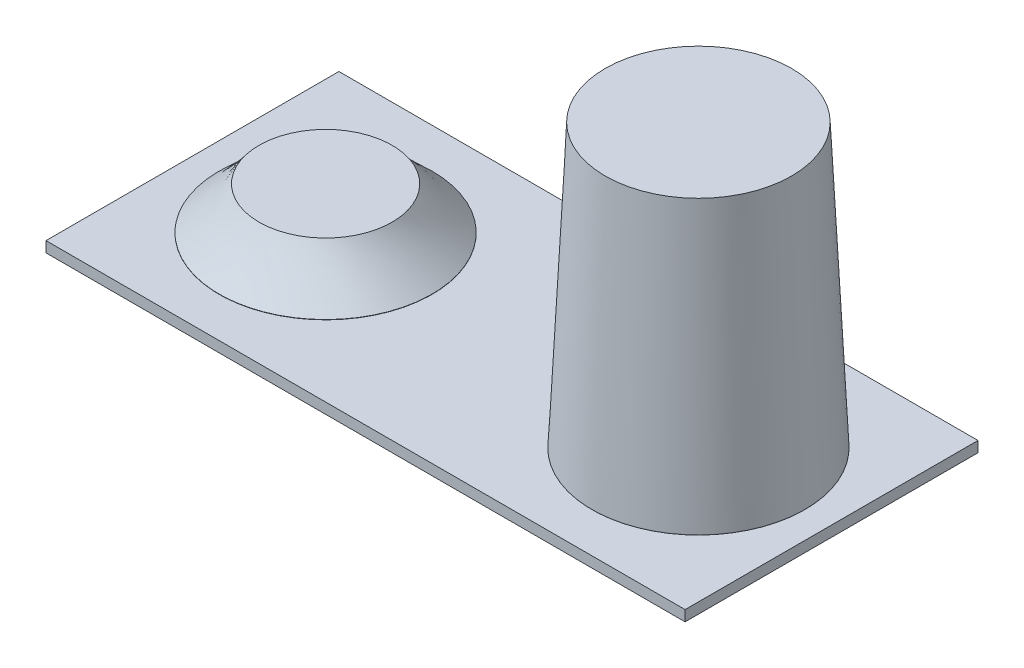
ISO-10303-21;
HEADER;
FILE_DESCRIPTION(('STEP AP214'),'2;1');
FILE_NAME('part.step','',(''),(''),'','','');
FILE_SCHEMA(('AUTOMOTIVE_DESIGN { 1 0 10303 214 1 1 1 1 }'));
ENDSEC;
DATA;
#1=APPLICATION_CONTEXT('core data for automotive mechanical design processes');
#2=APPLICATION_PROTOCOL_DEFINITION('international standard','automotive_design',2000,#1);
#3=PRODUCT_CONTEXT('',#1,'mechanical');
#4=PRODUCT('Part','Part','',(#3));
#5=PRODUCT_RELATED_PRODUCT_CATEGORY('part','',(#4));
#6=PRODUCT_DEFINITION_FORMATION('','',#4);
#7=PRODUCT_DEFINITION_CONTEXT('part definition',#1,'design');
#8=PRODUCT_DEFINITION('design','',#6,#7);
#9=PRODUCT_DEFINITION_SHAPE('','',#8);
#10=(LENGTH_UNIT() NAMED_UNIT(*) SI_UNIT(.MILLI.,.METRE.));
#11=(NAMED_UNIT(*) PLANE_ANGLE_UNIT() SI_UNIT($,.RADIAN.));
#12=(NAMED_UNIT(*) SI_UNIT($,.STERADIAN.) SOLID_ANGLE_UNIT());
#13=UNCERTAINTY_MEASURE_WITH_UNIT(LENGTH_MEASURE(1.E-05),#10,'distance_accuracy_value','');
#14=(GEOMETRIC_REPRESENTATION_CONTEXT(3) GLOBAL_UNCERTAINTY_ASSIGNED_CONTEXT((#13)) GLOBAL_UNIT_ASSIGNED_CONTEXT((#10,
#11,#12)) REPRESENTATION_CONTEXT('',''));
#15=CARTESIAN_POINT('',(0.,0.,0.));
#16=DIRECTION('',(0.,0.,1.));
#17=DIRECTION('',(1.,0.,0.));
#18=AXIS2_PLACEMENT_3D('',#15,#16,#17);
#19=CARTESIAN_POINT('',(-5.,0.4,-5.5));
#20=DIRECTION('',(1.,0.,0.));
#21=DIRECTION('',(0.,0.,-1.));
#22=AXIS2_PLACEMENT_3D('',#19,#20,#21);
#23=PLANE('',#22);
#24=DIRECTION('',(0.,0.,1.));
#25=VECTOR('',#24,1.);
#26=CARTESIAN_POINT('',(-5.,0.,-5.5));
#27=LINE('',#26,#25);
#28=CARTESIAN_POINT('',(-5.,0.,-5.5));
#29=VERTEX_POINT('',#28);
#30=CARTESIAN_POINT('',(-5.,0.,5.5));
#31=VERTEX_POINT('',#30);
#32=EDGE_CURVE('E104',#29,#31,#27,.T.);
#33=ORIENTED_EDGE('',*,*,#32,.T.);
#34=DIRECTION('',(0.,-1.,0.));
#35=VECTOR('',#34,1.);
#36=CARTESIAN_POINT('',(-5.,0.4,5.5));
#37=LINE('',#36,#35);
#38=CARTESIAN_POINT('',(-5.,0.4,5.5));
#39=VERTEX_POINT('',#38);
#40=EDGE_CURVE('E12',#39,#31,#37,.T.);
#41=ORIENTED_EDGE('',*,*,#40,.F.);
#42=DIRECTION('',(0.,0.,1.));
#43=VECTOR('',#42,1.);
#44=CARTESIAN_POINT('',(-5.,0.4,-5.5));
#45=LINE('',#44,#43);
#46=CARTESIAN_POINT('',(-5.,0.4,-5.5));
#47=VERTEX_POINT('',#46);
#48=EDGE_CURVE('E90',#47,#39,#45,.T.);
#49=ORIENTED_EDGE('',*,*,#48,.F.);
#50=DIRECTION('',(0.,-1.,0.));
#51=VECTOR('',#50,1.);
#52=CARTESIAN_POINT('',(-5.,0.4,-5.5));
#53=LINE('',#52,#51);
#54=EDGE_CURVE('E57',#47,#29,#53,.T.);
#55=ORIENTED_EDGE('',*,*,#54,.T.);
#56=EDGE_LOOP('',(#33,#41,#49,#55));
#57=FACE_BOUND('',#56,.T.);
#58=ADVANCED_FACE('F41',(#57),#23,.F.);
#59=CARTESIAN_POINT('',(-5.,0.4,5.5));
#60=DIRECTION('',(0.,0.,-1.));
#61=DIRECTION('',(-1.,0.,0.));
#62=AXIS2_PLACEMENT_3D('',#59,#60,#61);
#63=PLANE('',#62);
#64=DIRECTION('',(1.,0.,0.));
#65=VECTOR('',#64,1.);
#66=CARTESIAN_POINT('',(-5.,0.,5.5));
#67=LINE('',#66,#65);
#68=CARTESIAN_POINT('',(19.,0.,5.5));
#69=VERTEX_POINT('',#68);
#70=EDGE_CURVE('E95',#31,#69,#67,.T.);
#71=ORIENTED_EDGE('',*,*,#70,.T.);
#72=DIRECTION('',(0.,-1.,0.));
#73=VECTOR('',#72,1.);
#74=CARTESIAN_POINT('',(19.,0.4,5.5));
#75=LINE('',#74,#73);
#76=CARTESIAN_POINT('',(19.,0.4,5.5));
#77=VERTEX_POINT('',#76);
#78=EDGE_CURVE('E49',#77,#69,#75,.T.);
#79=ORIENTED_EDGE('',*,*,#78,.F.);
#80=DIRECTION('',(1.,0.,0.));
#81=VECTOR('',#80,1.);
#82=CARTESIAN_POINT('',(-5.,0.4,5.5));
#83=LINE('',#82,#81);
#84=EDGE_CURVE('E82',#39,#77,#83,.T.);
#85=ORIENTED_EDGE('',*,*,#84,.F.);
#86=ORIENTED_EDGE('',*,*,#40,.T.);
#87=EDGE_LOOP('',(#71,#79,#85,#86));
#88=FACE_BOUND('',#87,.T.);
#89=ADVANCED_FACE('F94',(#88),#63,.F.);
#90=CARTESIAN_POINT('',(19.,0.4,-5.5));
#91=DIRECTION('',(1.,0.,0.));
#92=DIRECTION('',(0.,0.,-1.));
#93=AXIS2_PLACEMENT_3D('',#90,#91,#92);
#94=PLANE('',#93);
#95=DIRECTION('',(0.,0.,1.));
#96=VECTOR('',#95,1.);
#97=CARTESIAN_POINT('',(19.,0.,-5.5));
#98=LINE('',#97,#96);
#99=CARTESIAN_POINT('',(19.,0.,-5.5));
#100=VERTEX_POINT('',#99);
#101=EDGE_CURVE('E108',#100,#69,#98,.T.);
#102=ORIENTED_EDGE('',*,*,#101,.F.);
#103=DIRECTION('',(0.,-1.,0.));
#104=VECTOR('',#103,1.);
#105=CARTESIAN_POINT('',(19.,0.4,-5.5));
#106=LINE('',#105,#104);
#107=CARTESIAN_POINT('',(19.,0.4,-5.5));
#108=VERTEX_POINT('',#107);
#109=EDGE_CURVE('E71',#108,#100,#106,.T.);
#110=ORIENTED_EDGE('',*,*,#109,.F.);
#111=DIRECTION('',(0.,0.,1.));
#112=VECTOR('',#111,1.);
#113=CARTESIAN_POINT('',(19.,0.4,-5.5));
#114=LINE('',#113,#112);
#115=EDGE_CURVE('E89',#108,#77,#114,.T.);
#116=ORIENTED_EDGE('',*,*,#115,.T.);
#117=ORIENTED_EDGE('',*,*,#78,.T.);
#118=EDGE_LOOP('',(#102,#110,#116,#117));
#119=FACE_BOUND('',#118,.T.);
#120=ADVANCED_FACE('F98',(#119),#94,.T.);
#121=CARTESIAN_POINT('',(-5.,0.4,-5.5));
#122=DIRECTION('',(0.,0.,-1.));
#123=DIRECTION('',(-1.,0.,0.));
#124=AXIS2_PLACEMENT_3D('',#121,#122,#123);
#125=PLANE('',#124);
#126=DIRECTION('',(1.,0.,0.));
#127=VECTOR('',#126,1.);
#128=CARTESIAN_POINT('',(-5.,0.,-5.5));
#129=LINE('',#128,#127);
#130=EDGE_CURVE('E110',#29,#100,#129,.T.);
#131=ORIENTED_EDGE('',*,*,#130,.F.);
#132=ORIENTED_EDGE('',*,*,#54,.F.);
#133=DIRECTION('',(1.,0.,0.));
#134=VECTOR('',#133,1.);
#135=CARTESIAN_POINT('',(-5.,0.4,-5.5));
#136=LINE('',#135,#134);
#137=EDGE_CURVE('E99',#47,#108,#136,.T.);
#138=ORIENTED_EDGE('',*,*,#137,.T.);
#139=ORIENTED_EDGE('',*,*,#109,.T.);
#140=EDGE_LOOP('',(#131,#132,#138,#139));
#141=FACE_BOUND('',#140,.T.);
#142=ADVANCED_FACE('F154',(#141),#125,.T.);
#143=CARTESIAN_POINT('',(0.,0.4,0.));
#144=DIRECTION('',(0.,1.,0.));
#145=DIRECTION('',(0.,0.,1.));
#146=AXIS2_PLACEMENT_3D('',#143,#144,#145);
#147=PLANE('',#146);
#148=CARTESIAN_POINT('',(14.,0.4,0.));
#149=DIRECTION('',(0.,1.,0.));
#150=DIRECTION('',(0.,0.,1.));
#151=AXIS2_PLACEMENT_3D('',#148,#149,#150);
#152=CIRCLE('',#151,4.);
#153=CARTESIAN_POINT('',(14.,0.4,-4.));
#154=VERTEX_POINT('',#153);
#155=EDGE_CURVE('E119',#154,#154,#152,.T.);
#156=ORIENTED_EDGE('',*,*,#155,.F.);
#157=EDGE_LOOP('',(#156));
#158=FACE_BOUND('',#157,.T.);
#159=CARTESIAN_POINT('',(0.,0.4,0.));
#160=DIRECTION('',(0.,1.,0.));
#161=DIRECTION('',(0.,0.,1.));
#162=AXIS2_PLACEMENT_3D('',#159,#160,#161);
#163=CIRCLE('',#162,4.);
#164=CARTESIAN_POINT('',(0.,0.4,-4.));
#165=VERTEX_POINT('',#164);
#166=EDGE_CURVE('E116',#165,#165,#163,.T.);
#167=ORIENTED_EDGE('',*,*,#166,.F.);
#168=EDGE_LOOP('',(#167));
#169=FACE_BOUND('',#168,.T.);
#170=ORIENTED_EDGE('',*,*,#48,.T.);
#171=ORIENTED_EDGE('',*,*,#84,.T.);
#172=ORIENTED_EDGE('',*,*,#115,.F.);
#173=ORIENTED_EDGE('',*,*,#137,.F.);
#174=EDGE_LOOP('',(#170,#171,#172,#173));
#175=FACE_BOUND('',#174,.T.);
#176=ADVANCED_FACE('F86',(#158,#169,#175),#147,.T.);
#177=CARTESIAN_POINT('',(0.,0.,0.));
#178=DIRECTION('',(0.,1.,0.));
#179=DIRECTION('',(0.,0.,1.));
#180=AXIS2_PLACEMENT_3D('',#177,#178,#179);
#181=PLANE('',#180);
#182=ORIENTED_EDGE('',*,*,#32,.F.);
#183=ORIENTED_EDGE('',*,*,#130,.T.);
#184=ORIENTED_EDGE('',*,*,#101,.T.);
#185=ORIENTED_EDGE('',*,*,#70,.F.);
#186=EDGE_LOOP('',(#182,#183,#184,#185));
#187=FACE_BOUND('',#186,.T.);
#188=ADVANCED_FACE('F153',(#187),#181,.F.);
#189=CARTESIAN_POINT('',(0.,0.41,0.));
#190=DIRECTION('',(0.,-1.,0.));
#191=DIRECTION('',(0.,0.,-1.));
#192=AXIS2_PLACEMENT_3D('',#189,#190,#191);
#193=CYLINDRICAL_SURFACE('',#192,4.);
#194=CARTESIAN_POINT('',(0.,0.41,0.));
#195=DIRECTION('',(0.,1.,0.));
#196=DIRECTION('',(0.,0.,1.));
#197=AXIS2_PLACEMENT_3D('',#194,#195,#196);
#198=CIRCLE('',#197,4.);
#199=CARTESIAN_POINT('',(0.,0.41,-4.));
#200=VERTEX_POINT('',#199);
#201=EDGE_CURVE('E106',#200,#200,#198,.T.);
#202=CARTESIAN_POINT('',(0.,0.41,-4.));
#203=CARTESIAN_POINT('',(0.,0.409895833333333,-4.));
#204=CARTESIAN_POINT('',(0.,0.409791666666667,-4.));
#205=CARTESIAN_POINT('',(0.,0.409583333333333,-4.));
#206=CARTESIAN_POINT('',(0.,0.409479166666667,-4.));
#207=CARTESIAN_POINT('',(0.,0.409270833333333,-4.));
#208=CARTESIAN_POINT('',(0.,0.409166666666667,-4.));
#209=CARTESIAN_POINT('',(0.,0.408958333333333,-4.));
#210=CARTESIAN_POINT('',(0.,0.408854166666667,-4.));
#211=CARTESIAN_POINT('',(0.,0.408645833333333,-4.));
#212=CARTESIAN_POINT('',(0.,0.408541666666667,-4.));
#213=CARTESIAN_POINT('',(0.,0.408333333333333,-4.));
#214=CARTESIAN_POINT('',(0.,0.408229166666667,-4.));
#215=CARTESIAN_POINT('',(0.,0.408020833333333,-4.));
#216=CARTESIAN_POINT('',(0.,0.407916666666667,-4.));
#217=CARTESIAN_POINT('',(0.,0.407708333333333,-4.));
#218=CARTESIAN_POINT('',(0.,0.407604166666667,-4.));
#219=CARTESIAN_POINT('',(0.,0.407395833333333,-4.));
#220=CARTESIAN_POINT('',(0.,0.407291666666667,-4.));
#221=CARTESIAN_POINT('',(0.,0.407083333333333,-4.));
#222=CARTESIAN_POINT('',(0.,0.406979166666667,-4.));
#223=CARTESIAN_POINT('',(0.,0.406770833333333,-4.));
#224=CARTESIAN_POINT('',(0.,0.406666666666667,-4.));
#225=CARTESIAN_POINT('',(0.,0.406458333333333,-4.));
#226=CARTESIAN_POINT('',(0.,0.406354166666667,-4.));
#227=CARTESIAN_POINT('',(0.,0.406145833333333,-4.));
#228=CARTESIAN_POINT('',(0.,0.406041666666667,-4.));
#229=CARTESIAN_POINT('',(0.,0.405833333333333,-4.));
#230=CARTESIAN_POINT('',(0.,0.405729166666667,-4.));
#231=CARTESIAN_POINT('',(0.,0.405520833333333,-4.));
#232=CARTESIAN_POINT('',(0.,0.405416666666667,-4.));
#233=CARTESIAN_POINT('',(0.,0.405208333333333,-4.));
#234=CARTESIAN_POINT('',(0.,0.405104166666667,-4.));
#235=CARTESIAN_POINT('',(0.,0.404895833333333,-4.));
#236=CARTESIAN_POINT('',(0.,0.404791666666667,-4.));
#237=CARTESIAN_POINT('',(0.,0.404583333333333,-4.));
#238=CARTESIAN_POINT('',(0.,0.404479166666667,-4.));
#239=CARTESIAN_POINT('',(0.,0.404270833333333,-4.));
#240=CARTESIAN_POINT('',(0.,0.404166666666667,-4.));
#241=CARTESIAN_POINT('',(0.,0.403958333333333,-4.));
#242=CARTESIAN_POINT('',(0.,0.403854166666667,-4.));
#243=CARTESIAN_POINT('',(0.,0.403645833333333,-4.));
#244=CARTESIAN_POINT('',(0.,0.403541666666667,-4.));
#245=CARTESIAN_POINT('',(0.,0.403333333333333,-4.));
#246=CARTESIAN_POINT('',(0.,0.403229166666667,-4.));
#247=CARTESIAN_POINT('',(0.,0.403020833333333,-4.));
#248=CARTESIAN_POINT('',(0.,0.402916666666667,-4.));
#249=CARTESIAN_POINT('',(0.,0.402708333333333,-4.));
#250=CARTESIAN_POINT('',(0.,0.402604166666667,-4.));
#251=CARTESIAN_POINT('',(0.,0.402395833333333,-4.));
#252=CARTESIAN_POINT('',(0.,0.402291666666667,-4.));
#253=CARTESIAN_POINT('',(0.,0.402083333333333,-4.));
#254=CARTESIAN_POINT('',(0.,0.401979166666667,-4.));
#255=CARTESIAN_POINT('',(0.,0.401770833333333,-4.));
#256=CARTESIAN_POINT('',(0.,0.401666666666667,-4.));
#257=CARTESIAN_POINT('',(0.,0.401458333333333,-4.));
#258=CARTESIAN_POINT('',(0.,0.401354166666667,-4.));
#259=CARTESIAN_POINT('',(0.,0.401145833333333,-4.));
#260=CARTESIAN_POINT('',(0.,0.401041666666667,-4.));
#261=CARTESIAN_POINT('',(0.,0.400833333333333,-4.));
#262=CARTESIAN_POINT('',(0.,0.400729166666667,-4.));
#263=CARTESIAN_POINT('',(0.,0.400520833333333,-4.));
#264=CARTESIAN_POINT('',(0.,0.400416666666667,-4.));
#265=CARTESIAN_POINT('',(0.,0.400208333333333,-4.));
#266=CARTESIAN_POINT('',(0.,0.400104166666667,-4.));
#267=CARTESIAN_POINT('',(0.,0.4,-4.));
#268=B_SPLINE_CURVE_WITH_KNOTS('',3,(#202,#203,#204,#205,#206,#207,#208,#209,#210,#211,#212,
#213,#214,#215,#216,#217,#218,#219,#220,#221,#222,#223,#224,#225,#226,#227,#228,#229,#230,#231,
#232,#233,#234,#235,#236,#237,#238,#239,#240,#241,#242,#243,#244,#245,#246,#247,#248,#249,#250,
#251,#252,#253,#254,#255,#256,#257,#258,#259,#260,#261,#262,#263,#264,#265,#266,#267),
.UNSPECIFIED.,.F.,.F.,(4,2,2,2,2,2,2,2,2,2,2,2,2,2,2,2,2,2,2,2,2,2,2,2,2,2,2,2,2,2,2,2,4),(0.,
0.000312499999999987,0.000624999999999975,0.000937499999999962,0.00124999999999995,
0.00156249999999999,0.00187499999999998,0.00218749999999997,0.00249999999999995,
0.00281249999999999,0.00312499999999998,0.00343749999999997,0.00374999999999996,0.0040625,
0.00437499999999998,0.00468749999999997,0.00499999999999996,0.0053125,0.00562499999999999,
0.00593749999999997,0.00624999999999996,0.0065625,0.00687499999999999,0.00718749999999998,
0.00749999999999997,0.00781250000000001,0.00812499999999999,0.00843749999999998,
0.00874999999999997,0.00906250000000001,0.009375,0.00968749999999998,0.00999999999999997),.UNSPECIFIED.);
#269=EDGE_CURVE('BSEAM147',#200,#165,#268,.T.);
#270=ORIENTED_EDGE('',*,*,#201,.F.);
#271=ORIENTED_EDGE('',*,*,#166,.T.);
#272=ORIENTED_EDGE('',*,*,#269,.T.);
#273=ORIENTED_EDGE('',*,*,#269,.F.);
#274=EDGE_LOOP('',(#270,#272,#271,#273));
#275=FACE_BOUND('',#274,.T.);
#276=ADVANCED_FACE('F147',(#275),#193,.T.);
#277=CARTESIAN_POINT('',(14.,0.41,0.));
#278=DIRECTION('',(0.,-1.,0.));
#279=DIRECTION('',(0.,0.,-1.));
#280=AXIS2_PLACEMENT_3D('',#277,#278,#279);
#281=CYLINDRICAL_SURFACE('',#280,4.);
#282=CARTESIAN_POINT('',(14.,0.41,0.));
#283=DIRECTION('',(0.,1.,0.));
#284=DIRECTION('',(0.,0.,1.));
#285=AXIS2_PLACEMENT_3D('',#282,#283,#284);
#286=CIRCLE('',#285,4.);
#287=CARTESIAN_POINT('',(14.,0.41,-4.));
#288=VERTEX_POINT('',#287);
#289=EDGE_CURVE('E122',#288,#288,#286,.T.);
#290=CARTESIAN_POINT('',(14.,0.41,-4.));
#291=CARTESIAN_POINT('',(14.,0.409895833333333,-4.));
#292=CARTESIAN_POINT('',(14.,0.409791666666667,-4.));
#293=CARTESIAN_POINT('',(14.,0.409583333333333,-4.));
#294=CARTESIAN_POINT('',(14.,0.409479166666667,-4.));
#295=CARTESIAN_POINT('',(14.,0.409270833333333,-4.));
#296=CARTESIAN_POINT('',(14.,0.409166666666667,-4.));
#297=CARTESIAN_POINT('',(14.,0.408958333333333,-4.));
#298=CARTESIAN_POINT('',(14.,0.408854166666667,-4.));
#299=CARTESIAN_POINT('',(14.,0.408645833333333,-4.));
#300=CARTESIAN_POINT('',(14.,0.408541666666667,-4.));
#301=CARTESIAN_POINT('',(14.,0.408333333333333,-4.));
#302=CARTESIAN_POINT('',(14.,0.408229166666667,-4.));
#303=CARTESIAN_POINT('',(14.,0.408020833333333,-4.));
#304=CARTESIAN_POINT('',(14.,0.407916666666667,-4.));
#305=CARTESIAN_POINT('',(14.,0.407708333333333,-4.));
#306=CARTESIAN_POINT('',(14.,0.407604166666667,-4.));
#307=CARTESIAN_POINT('',(14.,0.407395833333333,-4.));
#308=CARTESIAN_POINT('',(14.,0.407291666666667,-4.));
#309=CARTESIAN_POINT('',(14.,0.407083333333333,-4.));
#310=CARTESIAN_POINT('',(14.,0.406979166666667,-4.));
#311=CARTESIAN_POINT('',(14.,0.406770833333333,-4.));
#312=CARTESIAN_POINT('',(14.,0.406666666666667,-4.));
#313=CARTESIAN_POINT('',(14.,0.406458333333333,-4.));
#314=CARTESIAN_POINT('',(14.,0.406354166666667,-4.));
#315=CARTESIAN_POINT('',(14.,0.406145833333333,-4.));
#316=CARTESIAN_POINT('',(14.,0.406041666666667,-4.));
#317=CARTESIAN_POINT('',(14.,0.405833333333333,-4.));
#318=CARTESIAN_POINT('',(14.,0.405729166666667,-4.));
#319=CARTESIAN_POINT('',(14.,0.405520833333333,-4.));
#320=CARTESIAN_POINT('',(14.,0.405416666666667,-4.));
#321=CARTESIAN_POINT('',(14.,0.405208333333333,-4.));
#322=CARTESIAN_POINT('',(14.,0.405104166666667,-4.));
#323=CARTESIAN_POINT('',(14.,0.404895833333333,-4.));
#324=CARTESIAN_POINT('',(14.,0.404791666666667,-4.));
#325=CARTESIAN_POINT('',(14.,0.404583333333333,-4.));
#326=CARTESIAN_POINT('',(14.,0.404479166666667,-4.));
#327=CARTESIAN_POINT('',(14.,0.404270833333333,-4.));
#328=CARTESIAN_POINT('',(14.,0.404166666666667,-4.));
#329=CARTESIAN_POINT('',(14.,0.403958333333333,-4.));
#330=CARTESIAN_POINT('',(14.,0.403854166666667,-4.));
#331=CARTESIAN_POINT('',(14.,0.403645833333333,-4.));
#332=CARTESIAN_POINT('',(14.,0.403541666666667,-4.));
#333=CARTESIAN_POINT('',(14.,0.403333333333333,-4.));
#334=CARTESIAN_POINT('',(14.,0.403229166666667,-4.));
#335=CARTESIAN_POINT('',(14.,0.403020833333333,-4.));
#336=CARTESIAN_POINT('',(14.,0.402916666666667,-4.));
#337=CARTESIAN_POINT('',(14.,0.402708333333333,-4.));
#338=CARTESIAN_POINT('',(14.,0.402604166666667,-4.));
#339=CARTESIAN_POINT('',(14.,0.402395833333333,-4.));
#340=CARTESIAN_POINT('',(14.,0.402291666666667,-4.));
#341=CARTESIAN_POINT('',(14.,0.402083333333333,-4.));
#342=CARTESIAN_POINT('',(14.,0.401979166666667,-4.));
#343=CARTESIAN_POINT('',(14.,0.401770833333333,-4.));
#344=CARTESIAN_POINT('',(14.,0.401666666666667,-4.));
#345=CARTESIAN_POINT('',(14.,0.401458333333333,-4.));
#346=CARTESIAN_POINT('',(14.,0.401354166666667,-4.));
#347=CARTESIAN_POINT('',(14.,0.401145833333333,-4.));
#348=CARTESIAN_POINT('',(14.,0.401041666666667,-4.));
#349=CARTESIAN_POINT('',(14.,0.400833333333333,-4.));
#350=CARTESIAN_POINT('',(14.,0.400729166666667,-4.));
#351=CARTESIAN_POINT('',(14.,0.400520833333333,-4.));
#352=CARTESIAN_POINT('',(14.,0.400416666666667,-4.));
#353=CARTESIAN_POINT('',(14.,0.400208333333333,-4.));
#354=CARTESIAN_POINT('',(14.,0.400104166666667,-4.));
#355=CARTESIAN_POINT('',(14.,0.4,-4.));
#356=B_SPLINE_CURVE_WITH_KNOTS('',3,(#290,#291,#292,#293,#294,#295,#296,#297,#298,#299,#300,
#301,#302,#303,#304,#305,#306,#307,#308,#309,#310,#311,#312,#313,#314,#315,#316,#317,#318,#319,
#320,#321,#322,#323,#324,#325,#326,#327,#328,#329,#330,#331,#332,#333,#334,#335,#336,#337,#338,
#339,#340,#341,#342,#343,#344,#345,#346,#347,#348,#349,#350,#351,#352,#353,#354,#355),
.UNSPECIFIED.,.F.,.F.,(4,2,2,2,2,2,2,2,2,2,2,2,2,2,2,2,2,2,2,2,2,2,2,2,2,2,2,2,2,2,2,2,4),(0.,
0.000312499999999987,0.000624999999999975,0.000937499999999962,0.00124999999999995,
0.00156249999999999,0.00187499999999998,0.00218749999999997,0.00249999999999995,
0.00281249999999999,0.00312499999999998,0.00343749999999997,0.00374999999999996,0.0040625,
0.00437499999999998,0.00468749999999997,0.00499999999999996,0.0053125,0.00562499999999999,
0.00593749999999997,0.00624999999999996,0.0065625,0.00687499999999999,0.00718749999999998,
0.00749999999999997,0.00781250000000001,0.00812499999999999,0.00843749999999998,
0.00874999999999997,0.00906250000000001,0.009375,0.00968749999999998,0.00999999999999997),.UNSPECIFIED.);
#357=EDGE_CURVE('BSEAM143',#288,#154,#356,.T.);
#358=ORIENTED_EDGE('',*,*,#289,.F.);
#359=ORIENTED_EDGE('',*,*,#155,.T.);
#360=ORIENTED_EDGE('',*,*,#357,.T.);
#361=ORIENTED_EDGE('',*,*,#357,.F.);
#362=EDGE_LOOP('',(#358,#360,#359,#361));
#363=FACE_BOUND('',#362,.T.);
#364=ADVANCED_FACE('F143',(#363),#281,.T.);
#365=CARTESIAN_POINT('',(-2.2491993048727,2.,1.09137641854685));
#366=CARTESIAN_POINT('',(-2.42373145705434,0.41,3.18206313955038));
#367=CARTESIAN_POINT('',(-4.4319521419664,2.,-3.40702219119855));
#368=CARTESIAN_POINT('',(-8.78785773615511,0.41,-1.66539977455831));
#369=CARTESIAN_POINT('',(0.0664464677789982,2.,-5.58977502829226));
#370=CARTESIAN_POINT('',(-3.94039482204642,0.41,-8.02952605365907));
#371=CARTESIAN_POINT('',(2.2491993048727,2.,-1.09137641854685));
#372=CARTESIAN_POINT('',(2.42373145705434,0.41,-3.18206313955038));
#373=CARTESIAN_POINT('',(4.43195214196641,2.,3.40702219119855));
#374=CARTESIAN_POINT('',(8.78785773615511,0.41,1.66539977455831));
#375=CARTESIAN_POINT('',(-0.0664464677789987,2.,5.58977502829226));
#376=CARTESIAN_POINT('',(3.94039482204642,0.41,8.02952605365907));
#377=CARTESIAN_POINT('',(-2.2491993048727,2.,1.09137641854685));
#378=CARTESIAN_POINT('',(-2.42373145705434,0.41,3.18206313955038));
#379=(BOUNDED_SURFACE() B_SPLINE_SURFACE(3,1,((#365,#366),(#367,#368),(#369,#370),(#371,#372),
(#373,#374),(#375,#376),(#377,#378)),.UNSPECIFIED.,.T.,.F.,.F.) B_SPLINE_SURFACE_WITH_KNOTS((4,
3,4),(2,2),(0.,0.5,1.),(0.,1.),
.UNSPECIFIED.) GEOMETRIC_REPRESENTATION_ITEM() RATIONAL_B_SPLINE_SURFACE(((1.,1.),
(0.333333333333333,0.333333333333333),(0.333333333333333,0.333333333333333),(1.,1.),
(0.333333333333333,0.333333333333333),(0.333333333333333,0.333333333333333),(1.,1.))) REPRESENTATION_ITEM('') SURFACE());
#380=CARTESIAN_POINT('',(0.,2.,0.));
#381=DIRECTION('',(0.,-1.,0.));
#382=DIRECTION('',(0.,0.,1.));
#383=AXIS2_PLACEMENT_3D('',#380,#381,#382);
#384=CIRCLE('',#383,2.5);
#385=CARTESIAN_POINT('',(0.,2.,2.5));
#386=VERTEX_POINT('',#385);
#387=EDGE_CURVE('E125',#386,#386,#384,.T.);
#388=ORIENTED_EDGE('',*,*,#387,.T.);
#389=EDGE_LOOP('',(#388));
#390=FACE_BOUND('',#389,.T.);
#391=ORIENTED_EDGE('',*,*,#201,.T.);
#392=EDGE_LOOP('',(#391));
#393=FACE_BOUND('',#392,.T.);
#394=ADVANCED_FACE('F146',(#390,#393),#379,.T.);
#395=CARTESIAN_POINT('',(0.,2.,0.));
#396=DIRECTION('',(0.,1.,0.));
#397=DIRECTION('',(0.,0.,1.));
#398=AXIS2_PLACEMENT_3D('',#395,#396,#397);
#399=PLANE('',#398);
#400=ORIENTED_EDGE('',*,*,#387,.F.);
#401=EDGE_LOOP('',(#400));
#402=FACE_BOUND('',#401,.T.);
#403=ADVANCED_FACE('F139',(#402),#399,.T.);
#404=CARTESIAN_POINT('',(14.,11.,0.));
#405=DIRECTION('',(0.,-1.,0.));
#406=DIRECTION('',(0.,0.,-1.));
#407=AXIS2_PLACEMENT_3D('',#404,#405,#406);
#408=CONICAL_SURFACE('',#407,3.5,0.047179316677725);
#409=CARTESIAN_POINT('',(14.,11.,0.));
#410=DIRECTION('',(0.,1.,0.));
#411=DIRECTION('',(0.,0.,1.));
#412=AXIS2_PLACEMENT_3D('',#409,#410,#411);
#413=CIRCLE('',#412,3.5);
#414=CARTESIAN_POINT('',(14.,11.,3.5));
#415=VERTEX_POINT('',#414);
#416=EDGE_CURVE('E130',#415,#415,#413,.T.);
#417=ORIENTED_EDGE('',*,*,#416,.F.);
#418=EDGE_LOOP('',(#417));
#419=FACE_BOUND('',#418,.T.);
#420=ORIENTED_EDGE('',*,*,#289,.T.);
#421=EDGE_LOOP('',(#420));
#422=FACE_BOUND('',#421,.T.);
#423=ADVANCED_FACE('F136',(#419,#422),#408,.T.);
#424=CARTESIAN_POINT('',(14.,11.,0.));
#425=DIRECTION('',(0.,1.,0.));
#426=DIRECTION('',(0.,0.,1.));
#427=AXIS2_PLACEMENT_3D('',#424,#425,#426);
#428=PLANE('',#427);
#429=ORIENTED_EDGE('',*,*,#416,.T.);
#430=EDGE_LOOP('',(#429));
#431=FACE_BOUND('',#430,.T.);
#432=ADVANCED_FACE('F134',(#431),#428,.T.);
#433=CLOSED_SHELL('',(#58,#89,#120,#142,#176,#188,#276,#364,#394,#403,#423,#432));
#434=MANIFOLD_SOLID_BREP('B2',#433);
#435=ADVANCED_BREP_SHAPE_REPRESENTATION('',(#18,#434),#14);
#436=SHAPE_DEFINITION_REPRESENTATION(#9,#435);
ENDSEC;
END-ISO-10303-21;
